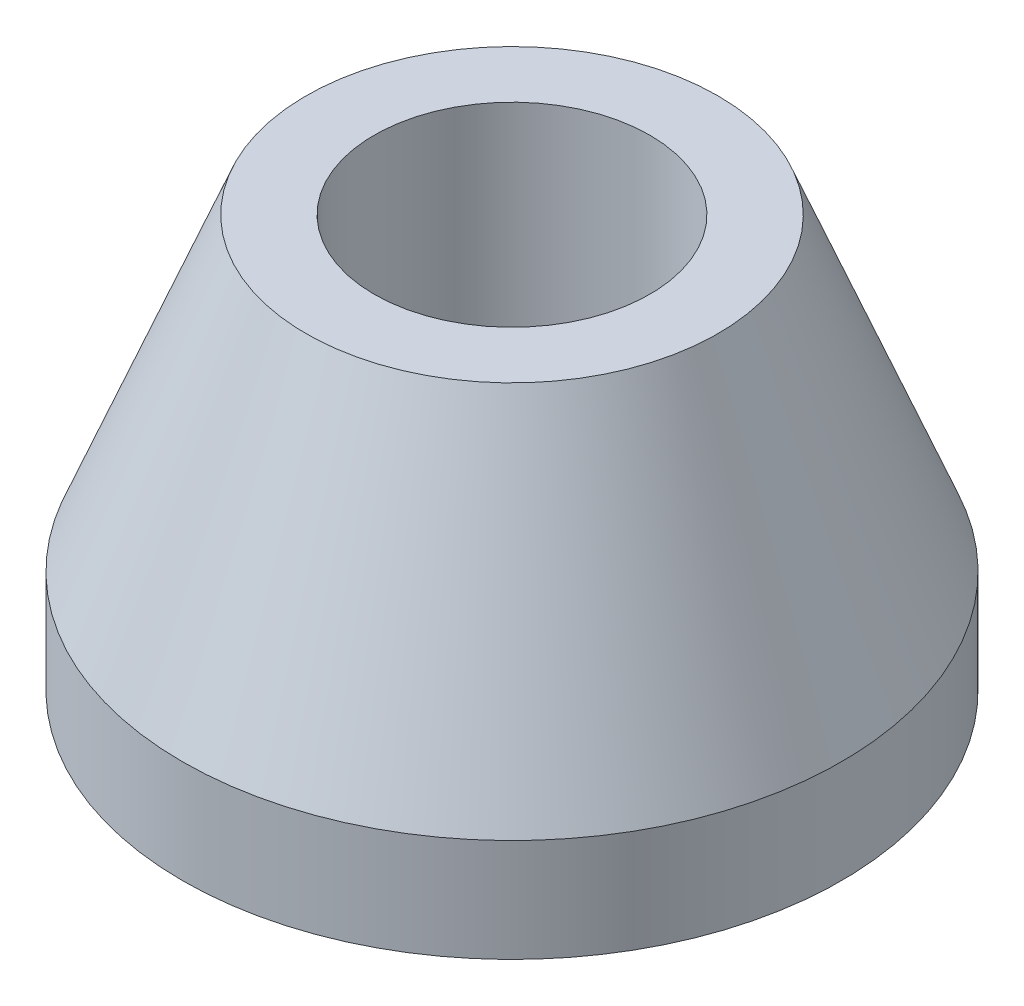
ISO-10303-21;
HEADER;
FILE_DESCRIPTION(('STEP AP214'),'2;1');
FILE_NAME('part.step','',(''),(''),'','','');
FILE_SCHEMA(('AUTOMOTIVE_DESIGN { 1 0 10303 214 1 1 1 1 }'));
ENDSEC;
DATA;
#1=APPLICATION_CONTEXT('core data for automotive mechanical design processes');
#2=APPLICATION_PROTOCOL_DEFINITION('international standard','automotive_design',2000,#1);
#3=PRODUCT_CONTEXT('',#1,'mechanical');
#4=PRODUCT('Part','Part','',(#3));
#5=PRODUCT_RELATED_PRODUCT_CATEGORY('part','',(#4));
#6=PRODUCT_DEFINITION_FORMATION('','',#4);
#7=PRODUCT_DEFINITION_CONTEXT('part definition',#1,'design');
#8=PRODUCT_DEFINITION('design','',#6,#7);
#9=PRODUCT_DEFINITION_SHAPE('','',#8);
#10=(LENGTH_UNIT() NAMED_UNIT(*) SI_UNIT(.MILLI.,.METRE.));
#11=(NAMED_UNIT(*) PLANE_ANGLE_UNIT() SI_UNIT($,.RADIAN.));
#12=(NAMED_UNIT(*) SI_UNIT($,.STERADIAN.) SOLID_ANGLE_UNIT());
#13=UNCERTAINTY_MEASURE_WITH_UNIT(LENGTH_MEASURE(1.E-05),#10,'distance_accuracy_value','');
#14=(GEOMETRIC_REPRESENTATION_CONTEXT(3) GLOBAL_UNCERTAINTY_ASSIGNED_CONTEXT((#13)) GLOBAL_UNIT_ASSIGNED_CONTEXT((#10,
#11,#12)) REPRESENTATION_CONTEXT('',''));
#15=CARTESIAN_POINT('',(0.,0.,0.));
#16=DIRECTION('',(0.,0.,1.));
#17=DIRECTION('',(1.,0.,0.));
#18=AXIS2_PLACEMENT_3D('',#15,#16,#17);
#19=CARTESIAN_POINT('',(0.,-12.7,0.));
#20=DIRECTION('',(0.,1.,0.));
#21=DIRECTION('',(0.,0.,1.));
#22=AXIS2_PLACEMENT_3D('',#19,#20,#21);
#23=CYLINDRICAL_SURFACE('',#22,4.25);
#24=CARTESIAN_POINT('',(0.,0.,0.));
#25=DIRECTION('',(0.,1.,0.));
#26=DIRECTION('',(0.,0.,1.));
#27=AXIS2_PLACEMENT_3D('',#24,#25,#26);
#28=CIRCLE('',#27,4.25);
#29=CARTESIAN_POINT('',(0.,0.,4.25));
#30=VERTEX_POINT('',#29);
#31=EDGE_CURVE('E142',#30,#30,#28,.T.);
#32=ORIENTED_EDGE('',*,*,#31,.T.);
#33=EDGE_LOOP('',(#32));
#34=FACE_BOUND('',#33,.T.);
#35=CARTESIAN_POINT('',(0.,-6.35,0.));
#36=DIRECTION('',(0.,-1.,0.));
#37=DIRECTION('',(0.,0.,-1.));
#38=AXIS2_PLACEMENT_3D('',#35,#36,#37);
#39=CIRCLE('',#38,4.25);
#40=CARTESIAN_POINT('',(0.,-6.35,-4.25));
#41=VERTEX_POINT('',#40);
#42=EDGE_CURVE('E37',#41,#41,#39,.F.);
#43=ORIENTED_EDGE('',*,*,#42,.F.);
#44=EDGE_LOOP('',(#43));
#45=FACE_BOUND('',#44,.T.);
#46=ADVANCED_FACE('F33',(#34,#45),#23,.F.);
#47=CARTESIAN_POINT('',(0.,0.,0.));
#48=DIRECTION('',(0.,-1.,0.));
#49=DIRECTION('',(0.,0.,-1.));
#50=AXIS2_PLACEMENT_3D('',#47,#48,#49);
#51=PLANE('',#50);
#52=ORIENTED_EDGE('',*,*,#31,.F.);
#53=EDGE_LOOP('',(#52));
#54=FACE_BOUND('',#53,.T.);
#55=CARTESIAN_POINT('',(0.,0.,0.));
#56=DIRECTION('',(0.,-1.,0.));
#57=DIRECTION('',(0.,0.,-1.));
#58=AXIS2_PLACEMENT_3D('',#55,#56,#57);
#59=CIRCLE('',#58,6.35);
#60=CARTESIAN_POINT('',(0.,0.,-6.35));
#61=VERTEX_POINT('',#60);
#62=EDGE_CURVE('E11',#61,#61,#59,.T.);
#63=ORIENTED_EDGE('',*,*,#62,.F.);
#64=EDGE_LOOP('',(#63));
#65=FACE_BOUND('',#64,.T.);
#66=ADVANCED_FACE('F35',(#54,#65),#51,.F.);
#67=CARTESIAN_POINT('',(0.,0.,0.));
#68=DIRECTION('',(0.,-1.,0.));
#69=DIRECTION('',(0.,0.,-1.));
#70=AXIS2_PLACEMENT_3D('',#67,#68,#69);
#71=CONICAL_SURFACE('',#70,6.35,0.380506377112365);
#72=CARTESIAN_POINT('',(0.,-9.525,0.));
#73=DIRECTION('',(0.,-1.,0.));
#74=DIRECTION('',(0.,0.,-1.));
#75=AXIS2_PLACEMENT_3D('',#72,#73,#74);
#76=CIRCLE('',#75,10.16);
#77=CARTESIAN_POINT('',(0.,-9.525,-10.16));
#78=VERTEX_POINT('',#77);
#79=EDGE_CURVE('E42',#78,#78,#76,.T.);
#80=ORIENTED_EDGE('',*,*,#79,.F.);
#81=EDGE_LOOP('',(#80));
#82=FACE_BOUND('',#81,.T.);
#83=ORIENTED_EDGE('',*,*,#62,.T.);
#84=EDGE_LOOP('',(#83));
#85=FACE_BOUND('',#84,.T.);
#86=ADVANCED_FACE('F153',(#82,#85),#71,.T.);
#87=CARTESIAN_POINT('',(0.,-12.7,0.));
#88=DIRECTION('',(0.,-1.,0.));
#89=DIRECTION('',(0.,0.,-1.));
#90=AXIS2_PLACEMENT_3D('',#87,#88,#89);
#91=CYLINDRICAL_SURFACE('',#90,10.16);
#92=CARTESIAN_POINT('',(0.,-12.7,0.));
#93=DIRECTION('',(0.,-1.,0.));
#94=DIRECTION('',(0.,0.,-1.));
#95=AXIS2_PLACEMENT_3D('',#92,#93,#94);
#96=CIRCLE('',#95,10.16);
#97=CARTESIAN_POINT('',(0.,-12.7,-10.16));
#98=VERTEX_POINT('',#97);
#99=EDGE_CURVE('E145',#98,#98,#96,.T.);
#100=ORIENTED_EDGE('',*,*,#99,.F.);
#101=EDGE_LOOP('',(#100));
#102=FACE_BOUND('',#101,.T.);
#103=ORIENTED_EDGE('',*,*,#79,.T.);
#104=EDGE_LOOP('',(#103));
#105=FACE_BOUND('',#104,.T.);
#106=ADVANCED_FACE('F151',(#102,#105),#91,.T.);
#107=CARTESIAN_POINT('',(0.,-12.7,10.16));
#108=DIRECTION('',(0.,1.,0.));
#109=DIRECTION('',(0.,0.,1.));
#110=AXIS2_PLACEMENT_3D('',#107,#108,#109);
#111=PLANE('',#110);
#112=DIRECTION('',(-0.866025403784439,0.,-0.5));
#113=VECTOR('',#112,1.);
#114=CARTESIAN_POINT('',(0.,-12.7,7.27461339178929));
#115=LINE('',#114,#113);
#116=CARTESIAN_POINT('',(0.,-12.7,7.27461339178929));
#117=VERTEX_POINT('',#116);
#118=CARTESIAN_POINT('',(-6.3,-12.7,3.63730669589465));
#119=VERTEX_POINT('',#118);
#120=EDGE_CURVE('E124',#117,#119,#115,.T.);
#121=ORIENTED_EDGE('',*,*,#120,.F.);
#122=DIRECTION('',(-0.866025403784439,0.,0.5));
#123=VECTOR('',#122,1.);
#124=CARTESIAN_POINT('',(6.3,-12.7,3.63730669589465));
#125=LINE('',#124,#123);
#126=CARTESIAN_POINT('',(6.3,-12.7,3.63730669589465));
#127=VERTEX_POINT('',#126);
#128=EDGE_CURVE('E49',#127,#117,#125,.T.);
#129=ORIENTED_EDGE('',*,*,#128,.F.);
#130=DIRECTION('',(0.,0.,1.));
#131=VECTOR('',#130,1.);
#132=CARTESIAN_POINT('',(6.3,-12.7,-3.63730669589464));
#133=LINE('',#132,#131);
#134=CARTESIAN_POINT('',(6.3,-12.7,-3.63730669589464));
#135=VERTEX_POINT('',#134);
#136=EDGE_CURVE('E133',#135,#127,#133,.T.);
#137=ORIENTED_EDGE('',*,*,#136,.F.);
#138=DIRECTION('',(0.866025403784439,0.,0.5));
#139=VECTOR('',#138,1.);
#140=CARTESIAN_POINT('',(0.,-12.7,-7.27461339178929));
#141=LINE('',#140,#139);
#142=CARTESIAN_POINT('',(0.,-12.7,-7.27461339178929));
#143=VERTEX_POINT('',#142);
#144=EDGE_CURVE('E131',#143,#135,#141,.T.);
#145=ORIENTED_EDGE('',*,*,#144,.F.);
#146=DIRECTION('',(0.866025403784438,0.,-0.5));
#147=VECTOR('',#146,1.);
#148=CARTESIAN_POINT('',(-6.3,-12.7,-3.63730669589464));
#149=LINE('',#148,#147);
#150=CARTESIAN_POINT('',(-6.3,-12.7,-3.63730669589464));
#151=VERTEX_POINT('',#150);
#152=EDGE_CURVE('E97',#151,#143,#149,.T.);
#153=ORIENTED_EDGE('',*,*,#152,.F.);
#154=DIRECTION('',(0.,0.,-1.));
#155=VECTOR('',#154,1.);
#156=CARTESIAN_POINT('',(-6.3,-12.7,3.63730669589465));
#157=LINE('',#156,#155);
#158=EDGE_CURVE('E127',#119,#151,#157,.T.);
#159=ORIENTED_EDGE('',*,*,#158,.F.);
#160=EDGE_LOOP('',(#121,#129,#137,#145,#153,#159));
#161=FACE_BOUND('',#160,.T.);
#162=ORIENTED_EDGE('',*,*,#99,.T.);
#163=EDGE_LOOP('',(#162));
#164=FACE_BOUND('',#163,.T.);
#165=ADVANCED_FACE('F171',(#161,#164),#111,.F.);
#166=CARTESIAN_POINT('',(0.,-6.35,0.));
#167=DIRECTION('',(0.,-1.,0.));
#168=DIRECTION('',(0.,0.,-1.));
#169=AXIS2_PLACEMENT_3D('',#166,#167,#168);
#170=PLANE('',#169);
#171=DIRECTION('',(-0.866025403784439,0.,0.5));
#172=VECTOR('',#171,1.);
#173=CARTESIAN_POINT('',(6.3,-6.35,3.63730669589465));
#174=LINE('',#173,#172);
#175=CARTESIAN_POINT('',(6.3,-6.35,3.63730669589465));
#176=VERTEX_POINT('',#175);
#177=CARTESIAN_POINT('',(0.,-6.35,7.27461339178929));
#178=VERTEX_POINT('',#177);
#179=EDGE_CURVE('E135',#176,#178,#174,.T.);
#180=ORIENTED_EDGE('',*,*,#179,.T.);
#181=DIRECTION('',(-0.866025403784439,0.,-0.5));
#182=VECTOR('',#181,1.);
#183=CARTESIAN_POINT('',(0.,-6.35,7.27461339178929));
#184=LINE('',#183,#182);
#185=CARTESIAN_POINT('',(-6.3,-6.35,3.63730669589465));
#186=VERTEX_POINT('',#185);
#187=EDGE_CURVE('E118',#178,#186,#184,.T.);
#188=ORIENTED_EDGE('',*,*,#187,.T.);
#189=DIRECTION('',(0.,0.,-1.));
#190=VECTOR('',#189,1.);
#191=CARTESIAN_POINT('',(-6.3,-6.35,3.63730669589465));
#192=LINE('',#191,#190);
#193=CARTESIAN_POINT('',(-6.3,-6.35,-3.63730669589464));
#194=VERTEX_POINT('',#193);
#195=EDGE_CURVE('E116',#186,#194,#192,.T.);
#196=ORIENTED_EDGE('',*,*,#195,.T.);
#197=DIRECTION('',(0.866025403784438,0.,-0.5));
#198=VECTOR('',#197,1.);
#199=CARTESIAN_POINT('',(-6.3,-6.35,-3.63730669589464));
#200=LINE('',#199,#198);
#201=CARTESIAN_POINT('',(0.,-6.35,-7.27461339178929));
#202=VERTEX_POINT('',#201);
#203=EDGE_CURVE('E94',#194,#202,#200,.T.);
#204=ORIENTED_EDGE('',*,*,#203,.T.);
#205=DIRECTION('',(0.866025403784439,0.,0.5));
#206=VECTOR('',#205,1.);
#207=CARTESIAN_POINT('',(0.,-6.35,-7.27461339178929));
#208=LINE('',#207,#206);
#209=CARTESIAN_POINT('',(6.3,-6.35,-3.63730669589464));
#210=VERTEX_POINT('',#209);
#211=EDGE_CURVE('E105',#202,#210,#208,.T.);
#212=ORIENTED_EDGE('',*,*,#211,.T.);
#213=DIRECTION('',(0.,0.,1.));
#214=VECTOR('',#213,1.);
#215=CARTESIAN_POINT('',(6.3,-6.35,-3.63730669589464));
#216=LINE('',#215,#214);
#217=EDGE_CURVE('E109',#210,#176,#216,.T.);
#218=ORIENTED_EDGE('',*,*,#217,.T.);
#219=EDGE_LOOP('',(#180,#188,#196,#204,#212,#218));
#220=FACE_BOUND('',#219,.T.);
#221=ORIENTED_EDGE('',*,*,#42,.T.);
#222=EDGE_LOOP('',(#221));
#223=FACE_BOUND('',#222,.T.);
#224=ADVANCED_FACE('F112',(#220,#223),#170,.T.);
#225=CARTESIAN_POINT('',(6.3,-6.35,3.63730669589465));
#226=DIRECTION('',(0.5,0.,0.866025403784439));
#227=DIRECTION('',(0.866025403784439,0.,-0.5));
#228=AXIS2_PLACEMENT_3D('',#225,#226,#227);
#229=PLANE('',#228);
#230=ORIENTED_EDGE('',*,*,#128,.T.);
#231=DIRECTION('',(0.,-1.,0.));
#232=VECTOR('',#231,1.);
#233=CARTESIAN_POINT('',(0.,-6.35,7.27461339178929));
#234=LINE('',#233,#232);
#235=EDGE_CURVE('E79',#178,#117,#234,.T.);
#236=ORIENTED_EDGE('',*,*,#235,.F.);
#237=ORIENTED_EDGE('',*,*,#179,.F.);
#238=DIRECTION('',(0.,-1.,0.));
#239=VECTOR('',#238,1.);
#240=CARTESIAN_POINT('',(6.3,-6.35,3.63730669589465));
#241=LINE('',#240,#239);
#242=EDGE_CURVE('E57',#176,#127,#241,.T.);
#243=ORIENTED_EDGE('',*,*,#242,.T.);
#244=EDGE_LOOP('',(#230,#236,#237,#243));
#245=FACE_BOUND('',#244,.T.);
#246=ADVANCED_FACE('F170',(#245),#229,.F.);
#247=CARTESIAN_POINT('',(6.3,-6.35,-3.63730669589464));
#248=DIRECTION('',(1.,0.,0.));
#249=DIRECTION('',(0.,0.,-1.));
#250=AXIS2_PLACEMENT_3D('',#247,#248,#249);
#251=PLANE('',#250);
#252=ORIENTED_EDGE('',*,*,#136,.T.);
#253=ORIENTED_EDGE('',*,*,#242,.F.);
#254=ORIENTED_EDGE('',*,*,#217,.F.);
#255=DIRECTION('',(0.,-1.,0.));
#256=VECTOR('',#255,1.);
#257=CARTESIAN_POINT('',(6.3,-6.35,-3.63730669589464));
#258=LINE('',#257,#256);
#259=EDGE_CURVE('E101',#210,#135,#258,.T.);
#260=ORIENTED_EDGE('',*,*,#259,.T.);
#261=EDGE_LOOP('',(#252,#253,#254,#260));
#262=FACE_BOUND('',#261,.T.);
#263=ADVANCED_FACE('F177',(#262),#251,.F.);
#264=CARTESIAN_POINT('',(0.,-6.35,-7.27461339178929));
#265=DIRECTION('',(0.5,0.,-0.866025403784439));
#266=DIRECTION('',(-0.866025403784439,0.,-0.5));
#267=AXIS2_PLACEMENT_3D('',#264,#265,#266);
#268=PLANE('',#267);
#269=ORIENTED_EDGE('',*,*,#144,.T.);
#270=ORIENTED_EDGE('',*,*,#259,.F.);
#271=ORIENTED_EDGE('',*,*,#211,.F.);
#272=DIRECTION('',(0.,-1.,0.));
#273=VECTOR('',#272,1.);
#274=CARTESIAN_POINT('',(0.,-6.35,-7.27461339178929));
#275=LINE('',#274,#273);
#276=EDGE_CURVE('E90',#202,#143,#275,.T.);
#277=ORIENTED_EDGE('',*,*,#276,.T.);
#278=EDGE_LOOP('',(#269,#270,#271,#277));
#279=FACE_BOUND('',#278,.T.);
#280=ADVANCED_FACE('F106',(#279),#268,.F.);
#281=CARTESIAN_POINT('',(-6.3,-6.35,-3.63730669589464));
#282=DIRECTION('',(-0.5,0.,-0.866025403784439));
#283=DIRECTION('',(-0.866025403784439,0.,0.5));
#284=AXIS2_PLACEMENT_3D('',#281,#282,#283);
#285=PLANE('',#284);
#286=ORIENTED_EDGE('',*,*,#152,.T.);
#287=ORIENTED_EDGE('',*,*,#276,.F.);
#288=ORIENTED_EDGE('',*,*,#203,.F.);
#289=DIRECTION('',(0.,-1.,0.));
#290=VECTOR('',#289,1.);
#291=CARTESIAN_POINT('',(-6.3,-6.35,-3.63730669589464));
#292=LINE('',#291,#290);
#293=EDGE_CURVE('E102',#194,#151,#292,.T.);
#294=ORIENTED_EDGE('',*,*,#293,.T.);
#295=EDGE_LOOP('',(#286,#287,#288,#294));
#296=FACE_BOUND('',#295,.T.);
#297=ADVANCED_FACE('F92',(#296),#285,.F.);
#298=CARTESIAN_POINT('',(-6.3,-6.35,3.63730669589465));
#299=DIRECTION('',(-1.,0.,0.));
#300=DIRECTION('',(0.,0.,1.));
#301=AXIS2_PLACEMENT_3D('',#298,#299,#300);
#302=PLANE('',#301);
#303=ORIENTED_EDGE('',*,*,#158,.T.);
#304=ORIENTED_EDGE('',*,*,#293,.F.);
#305=ORIENTED_EDGE('',*,*,#195,.F.);
#306=DIRECTION('',(0.,-1.,0.));
#307=VECTOR('',#306,1.);
#308=CARTESIAN_POINT('',(-6.3,-6.35,3.63730669589465));
#309=LINE('',#308,#307);
#310=EDGE_CURVE('E139',#186,#119,#309,.T.);
#311=ORIENTED_EDGE('',*,*,#310,.T.);
#312=EDGE_LOOP('',(#303,#304,#305,#311));
#313=FACE_BOUND('',#312,.T.);
#314=ADVANCED_FACE('F188',(#313),#302,.F.);
#315=CARTESIAN_POINT('',(0.,-6.35,7.27461339178929));
#316=DIRECTION('',(-0.5,0.,0.866025403784439));
#317=DIRECTION('',(0.866025403784439,0.,0.5));
#318=AXIS2_PLACEMENT_3D('',#315,#316,#317);
#319=PLANE('',#318);
#320=ORIENTED_EDGE('',*,*,#120,.T.);
#321=ORIENTED_EDGE('',*,*,#310,.F.);
#322=ORIENTED_EDGE('',*,*,#187,.F.);
#323=ORIENTED_EDGE('',*,*,#235,.T.);
#324=EDGE_LOOP('',(#320,#321,#322,#323));
#325=FACE_BOUND('',#324,.T.);
#326=ADVANCED_FACE('F191',(#325),#319,.F.);
#327=CLOSED_SHELL('',(#46,#66,#86,#106,#165,#224,#246,#263,#280,#297,#314,#326));
#328=MANIFOLD_SOLID_BREP('B2',#327);
#329=ADVANCED_BREP_SHAPE_REPRESENTATION('',(#18,#328),#14);
#330=SHAPE_DEFINITION_REPRESENTATION(#9,#329);
ENDSEC;
END-ISO-10303-21;
